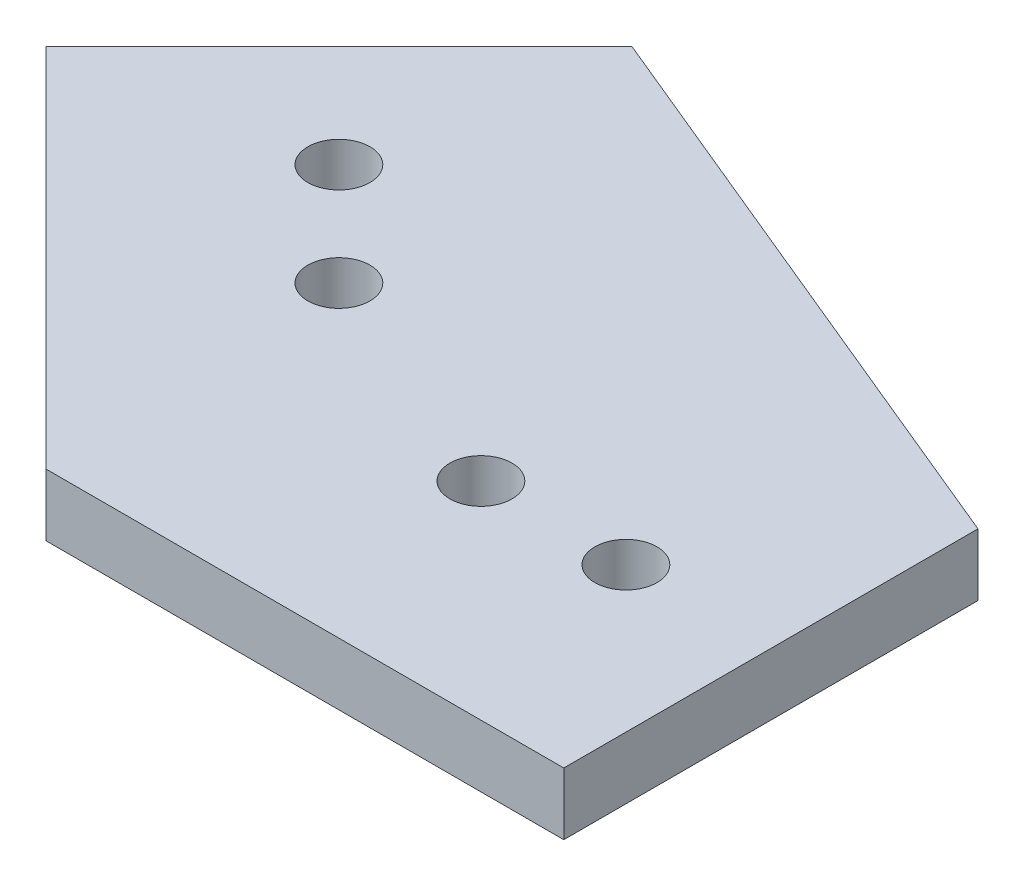
ISO-10303-21;
HEADER;
FILE_DESCRIPTION(('STEP AP214'),'2;1');
FILE_NAME('part.step','',(''),(''),'','','');
FILE_SCHEMA(('AUTOMOTIVE_DESIGN { 1 0 10303 214 1 1 1 1 }'));
ENDSEC;
DATA;
#1=APPLICATION_CONTEXT('core data for automotive mechanical design processes');
#2=APPLICATION_PROTOCOL_DEFINITION('international standard','automotive_design',2000,#1);
#3=PRODUCT_CONTEXT('',#1,'mechanical');
#4=PRODUCT('Part','Part','',(#3));
#5=PRODUCT_RELATED_PRODUCT_CATEGORY('part','',(#4));
#6=PRODUCT_DEFINITION_FORMATION('','',#4);
#7=PRODUCT_DEFINITION_CONTEXT('part definition',#1,'design');
#8=PRODUCT_DEFINITION('design','',#6,#7);
#9=PRODUCT_DEFINITION_SHAPE('','',#8);
#10=(LENGTH_UNIT() NAMED_UNIT(*) SI_UNIT(.MILLI.,.METRE.));
#11=(NAMED_UNIT(*) PLANE_ANGLE_UNIT() SI_UNIT($,.RADIAN.));
#12=(NAMED_UNIT(*) SI_UNIT($,.STERADIAN.) SOLID_ANGLE_UNIT());
#13=UNCERTAINTY_MEASURE_WITH_UNIT(LENGTH_MEASURE(1.E-05),#10,'distance_accuracy_value','');
#14=(GEOMETRIC_REPRESENTATION_CONTEXT(3) GLOBAL_UNCERTAINTY_ASSIGNED_CONTEXT((#13)) GLOBAL_UNIT_ASSIGNED_CONTEXT((#10,
#11,#12)) REPRESENTATION_CONTEXT('',''));
#15=CARTESIAN_POINT('',(0.,0.,0.));
#16=DIRECTION('',(0.,0.,1.));
#17=DIRECTION('',(1.,0.,0.));
#18=AXIS2_PLACEMENT_3D('',#15,#16,#17);
#19=CARTESIAN_POINT('',(0.,3.,0.));
#20=DIRECTION('',(0.,-1.,0.));
#21=DIRECTION('',(0.,0.,-1.));
#22=AXIS2_PLACEMENT_3D('',#19,#20,#21);
#23=PLANE('',#22);
#24=DIRECTION('',(0.707106781186551,0.,0.707106781186544));
#25=VECTOR('',#24,1.);
#26=CARTESIAN_POINT('',(0.,3.,0.));
#27=LINE('',#26,#25);
#28=CARTESIAN_POINT('',(-17.6776695296638,3.,-17.6776695296636));
#29=VERTEX_POINT('',#28);
#30=CARTESIAN_POINT('',(0.,3.,0.));
#31=VERTEX_POINT('',#30);
#32=EDGE_CURVE('E133',#29,#31,#27,.T.);
#33=ORIENTED_EDGE('',*,*,#32,.T.);
#34=DIRECTION('',(1.,0.,0.));
#35=VECTOR('',#34,1.);
#36=CARTESIAN_POINT('',(0.,3.,0.));
#37=LINE('',#36,#35);
#38=CARTESIAN_POINT('',(25.,3.,0.));
#39=VERTEX_POINT('',#38);
#40=EDGE_CURVE('E91',#31,#39,#37,.T.);
#41=ORIENTED_EDGE('',*,*,#40,.T.);
#42=DIRECTION('',(0.,0.,-1.));
#43=VECTOR('',#42,1.);
#44=CARTESIAN_POINT('',(25.,3.,0.));
#45=LINE('',#44,#43);
#46=CARTESIAN_POINT('',(25.,3.,-20.));
#47=VERTEX_POINT('',#46);
#48=EDGE_CURVE('E95',#39,#47,#45,.T.);
#49=ORIENTED_EDGE('',*,*,#48,.T.);
#50=DIRECTION('',(-0.923879532511288,0.,-0.382683432365087));
#51=VECTOR('',#50,1.);
#52=CARTESIAN_POINT('',(25.,3.,-20.));
#53=LINE('',#52,#51);
#54=CARTESIAN_POINT('',(-3.53553390593292,3.,-31.8198051533946));
#55=VERTEX_POINT('',#54);
#56=EDGE_CURVE('E99',#47,#55,#53,.T.);
#57=ORIENTED_EDGE('',*,*,#56,.T.);
#58=DIRECTION('',(-0.707106781186543,0.,0.707106781186552));
#59=VECTOR('',#58,1.);
#60=CARTESIAN_POINT('',(-17.6776695296638,3.,-17.6776695296636));
#61=LINE('',#60,#59);
#62=EDGE_CURVE('E57',#55,#29,#61,.T.);
#63=ORIENTED_EDGE('',*,*,#62,.T.);
#64=EDGE_LOOP('',(#33,#41,#49,#57,#63));
#65=FACE_BOUND('',#64,.T.);
#66=CARTESIAN_POINT('',(18.,3.,-10.));
#67=DIRECTION('',(0.,1.,0.));
#68=DIRECTION('',(0.,0.,1.));
#69=AXIS2_PLACEMENT_3D('',#66,#67,#68);
#70=CIRCLE('',#69,1.5);
#71=CARTESIAN_POINT('',(18.,3.,-8.5));
#72=VERTEX_POINT('',#71);
#73=EDGE_CURVE('E124',#72,#72,#70,.T.);
#74=ORIENTED_EDGE('',*,*,#73,.F.);
#75=EDGE_LOOP('',(#74));
#76=FACE_BOUND('',#75,.T.);
#77=CARTESIAN_POINT('',(11.,3.,-10.));
#78=DIRECTION('',(0.,1.,0.));
#79=DIRECTION('',(0.,0.,1.));
#80=AXIS2_PLACEMENT_3D('',#77,#78,#79);
#81=CIRCLE('',#80,1.5);
#82=CARTESIAN_POINT('',(11.,3.,-8.5));
#83=VERTEX_POINT('',#82);
#84=EDGE_CURVE('E199',#83,#83,#81,.T.);
#85=ORIENTED_EDGE('',*,*,#84,.F.);
#86=EDGE_LOOP('',(#85));
#87=FACE_BOUND('',#86,.T.);
#88=CARTESIAN_POINT('',(-5.65685424949249,3.,-19.7989898732233));
#89=DIRECTION('',(0.,1.,0.));
#90=DIRECTION('',(0.,0.,-1.));
#91=AXIS2_PLACEMENT_3D('',#88,#89,#90);
#92=CIRCLE('',#91,1.50000000000001);
#93=CARTESIAN_POINT('',(-5.65685424949249,3.,-21.2989898732233));
#94=VERTEX_POINT('',#93);
#95=EDGE_CURVE('E191',#94,#94,#92,.T.);
#96=ORIENTED_EDGE('',*,*,#95,.F.);
#97=EDGE_LOOP('',(#96));
#98=FACE_BOUND('',#97,.T.);
#99=CARTESIAN_POINT('',(-0.70710678118663,3.,-14.8492424049175));
#100=DIRECTION('',(0.,1.,0.));
#101=DIRECTION('',(0.,0.,-1.));
#102=AXIS2_PLACEMENT_3D('',#99,#100,#101);
#103=CIRCLE('',#102,1.5);
#104=CARTESIAN_POINT('',(-0.70710678118663,3.,-16.3492424049175));
#105=VERTEX_POINT('',#104);
#106=EDGE_CURVE('E180',#105,#105,#103,.T.);
#107=ORIENTED_EDGE('',*,*,#106,.F.);
#108=EDGE_LOOP('',(#107));
#109=FACE_BOUND('',#108,.T.);
#110=ADVANCED_FACE('F39',(#65,#76,#87,#98,#109),#23,.F.);
#111=CARTESIAN_POINT('',(0.,0.,0.));
#112=DIRECTION('',(0.,-1.,0.));
#113=DIRECTION('',(0.,0.,-1.));
#114=AXIS2_PLACEMENT_3D('',#111,#112,#113);
#115=PLANE('',#114);
#116=CARTESIAN_POINT('',(-5.65685424949249,0.,-19.7989898732233));
#117=DIRECTION('',(0.,1.,0.));
#118=DIRECTION('',(0.,0.,-1.));
#119=AXIS2_PLACEMENT_3D('',#116,#117,#118);
#120=CIRCLE('',#119,1.50000000000001);
#121=CARTESIAN_POINT('',(-5.65685424949249,0.,-21.2989898732233));
#122=VERTEX_POINT('',#121);
#123=EDGE_CURVE('E188',#122,#122,#120,.T.);
#124=ORIENTED_EDGE('',*,*,#123,.T.);
#125=EDGE_LOOP('',(#124));
#126=FACE_BOUND('',#125,.T.);
#127=CARTESIAN_POINT('',(18.,0.,-10.));
#128=DIRECTION('',(0.,1.,0.));
#129=DIRECTION('',(0.,0.,1.));
#130=AXIS2_PLACEMENT_3D('',#127,#128,#129);
#131=CIRCLE('',#130,1.5);
#132=CARTESIAN_POINT('',(18.,0.,-8.5));
#133=VERTEX_POINT('',#132);
#134=EDGE_CURVE('E203',#133,#133,#131,.T.);
#135=ORIENTED_EDGE('',*,*,#134,.T.);
#136=EDGE_LOOP('',(#135));
#137=FACE_BOUND('',#136,.T.);
#138=DIRECTION('',(0.707106781186551,0.,0.707106781186544));
#139=VECTOR('',#138,1.);
#140=CARTESIAN_POINT('',(0.,0.,0.));
#141=LINE('',#140,#139);
#142=CARTESIAN_POINT('',(-17.6776695296638,0.,-17.6776695296636));
#143=VERTEX_POINT('',#142);
#144=CARTESIAN_POINT('',(0.,0.,0.));
#145=VERTEX_POINT('',#144);
#146=EDGE_CURVE('E119',#143,#145,#141,.T.);
#147=ORIENTED_EDGE('',*,*,#146,.F.);
#148=DIRECTION('',(-0.707106781186543,0.,0.707106781186552));
#149=VECTOR('',#148,1.);
#150=CARTESIAN_POINT('',(-17.6776695296638,0.,-17.6776695296636));
#151=LINE('',#150,#149);
#152=CARTESIAN_POINT('',(-3.53553390593292,0.,-31.8198051533946));
#153=VERTEX_POINT('',#152);
#154=EDGE_CURVE('E83',#153,#143,#151,.T.);
#155=ORIENTED_EDGE('',*,*,#154,.F.);
#156=DIRECTION('',(-0.923879532511288,0.,-0.382683432365087));
#157=VECTOR('',#156,1.);
#158=CARTESIAN_POINT('',(25.,0.,-20.));
#159=LINE('',#158,#157);
#160=CARTESIAN_POINT('',(25.,0.,-20.));
#161=VERTEX_POINT('',#160);
#162=EDGE_CURVE('E77',#161,#153,#159,.T.);
#163=ORIENTED_EDGE('',*,*,#162,.F.);
#164=DIRECTION('',(0.,0.,-1.));
#165=VECTOR('',#164,1.);
#166=CARTESIAN_POINT('',(25.,0.,0.));
#167=LINE('',#166,#165);
#168=CARTESIAN_POINT('',(25.,0.,0.));
#169=VERTEX_POINT('',#168);
#170=EDGE_CURVE('E107',#169,#161,#167,.T.);
#171=ORIENTED_EDGE('',*,*,#170,.F.);
#172=DIRECTION('',(1.,0.,0.));
#173=VECTOR('',#172,1.);
#174=CARTESIAN_POINT('',(0.,0.,0.));
#175=LINE('',#174,#173);
#176=EDGE_CURVE('E123',#145,#169,#175,.T.);
#177=ORIENTED_EDGE('',*,*,#176,.F.);
#178=EDGE_LOOP('',(#147,#155,#163,#171,#177));
#179=FACE_BOUND('',#178,.T.);
#180=CARTESIAN_POINT('',(11.,0.,-10.));
#181=DIRECTION('',(0.,1.,0.));
#182=DIRECTION('',(0.,0.,1.));
#183=AXIS2_PLACEMENT_3D('',#180,#181,#182);
#184=CIRCLE('',#183,1.5);
#185=CARTESIAN_POINT('',(11.,0.,-8.5));
#186=VERTEX_POINT('',#185);
#187=EDGE_CURVE('E195',#186,#186,#184,.T.);
#188=ORIENTED_EDGE('',*,*,#187,.T.);
#189=EDGE_LOOP('',(#188));
#190=FACE_BOUND('',#189,.T.);
#191=CARTESIAN_POINT('',(-0.70710678118663,0.,-14.8492424049175));
#192=DIRECTION('',(0.,1.,0.));
#193=DIRECTION('',(0.,0.,-1.));
#194=AXIS2_PLACEMENT_3D('',#191,#192,#193);
#195=CIRCLE('',#194,1.5);
#196=CARTESIAN_POINT('',(-0.70710678118663,0.,-16.3492424049175));
#197=VERTEX_POINT('',#196);
#198=EDGE_CURVE('E183',#197,#197,#195,.T.);
#199=ORIENTED_EDGE('',*,*,#198,.T.);
#200=EDGE_LOOP('',(#199));
#201=FACE_BOUND('',#200,.T.);
#202=ADVANCED_FACE('F140',(#126,#137,#179,#190,#201),#115,.T.);
#203=CARTESIAN_POINT('',(0.,3.,0.));
#204=DIRECTION('',(0.707106781186544,0.,-0.707106781186551));
#205=DIRECTION('',(-0.707106781186551,0.,-0.707106781186544));
#206=AXIS2_PLACEMENT_3D('',#203,#204,#205);
#207=PLANE('',#206);
#208=ORIENTED_EDGE('',*,*,#146,.T.);
#209=DIRECTION('',(0.,-1.,0.));
#210=VECTOR('',#209,1.);
#211=CARTESIAN_POINT('',(0.,3.,0.));
#212=LINE('',#211,#210);
#213=EDGE_CURVE('E11',#31,#145,#212,.T.);
#214=ORIENTED_EDGE('',*,*,#213,.F.);
#215=ORIENTED_EDGE('',*,*,#32,.F.);
#216=DIRECTION('',(0.,-1.,0.));
#217=VECTOR('',#216,1.);
#218=CARTESIAN_POINT('',(-17.6776695296638,3.,-17.6776695296636));
#219=LINE('',#218,#217);
#220=EDGE_CURVE('E115',#29,#143,#219,.T.);
#221=ORIENTED_EDGE('',*,*,#220,.T.);
#222=EDGE_LOOP('',(#208,#214,#215,#221));
#223=FACE_BOUND('',#222,.T.);
#224=ADVANCED_FACE('F41',(#223),#207,.F.);
#225=CARTESIAN_POINT('',(0.,3.,0.));
#226=DIRECTION('',(0.,0.,-1.));
#227=DIRECTION('',(-1.,0.,0.));
#228=AXIS2_PLACEMENT_3D('',#225,#226,#227);
#229=PLANE('',#228);
#230=ORIENTED_EDGE('',*,*,#176,.T.);
#231=DIRECTION('',(0.,-1.,0.));
#232=VECTOR('',#231,1.);
#233=CARTESIAN_POINT('',(25.,3.,0.));
#234=LINE('',#233,#232);
#235=EDGE_CURVE('E49',#39,#169,#234,.T.);
#236=ORIENTED_EDGE('',*,*,#235,.F.);
#237=ORIENTED_EDGE('',*,*,#40,.F.);
#238=ORIENTED_EDGE('',*,*,#213,.T.);
#239=EDGE_LOOP('',(#230,#236,#237,#238));
#240=FACE_BOUND('',#239,.T.);
#241=ADVANCED_FACE('F259',(#240),#229,.F.);
#242=CARTESIAN_POINT('',(25.,3.,0.));
#243=DIRECTION('',(-1.,0.,0.));
#244=DIRECTION('',(0.,0.,1.));
#245=AXIS2_PLACEMENT_3D('',#242,#243,#244);
#246=PLANE('',#245);
#247=ORIENTED_EDGE('',*,*,#170,.T.);
#248=DIRECTION('',(0.,-1.,0.));
#249=VECTOR('',#248,1.);
#250=CARTESIAN_POINT('',(25.,3.,-20.));
#251=LINE('',#250,#249);
#252=EDGE_CURVE('E104',#47,#161,#251,.T.);
#253=ORIENTED_EDGE('',*,*,#252,.F.);
#254=ORIENTED_EDGE('',*,*,#48,.F.);
#255=ORIENTED_EDGE('',*,*,#235,.T.);
#256=EDGE_LOOP('',(#247,#253,#254,#255));
#257=FACE_BOUND('',#256,.T.);
#258=ADVANCED_FACE('F105',(#257),#246,.F.);
#259=CARTESIAN_POINT('',(25.,3.,-20.));
#260=DIRECTION('',(-0.382683432365087,0.,0.923879532511288));
#261=DIRECTION('',(0.923879532511288,0.,0.382683432365087));
#262=AXIS2_PLACEMENT_3D('',#259,#260,#261);
#263=PLANE('',#262);
#264=ORIENTED_EDGE('',*,*,#162,.T.);
#265=DIRECTION('',(0.,-1.,0.));
#266=VECTOR('',#265,1.);
#267=CARTESIAN_POINT('',(-3.53553390593292,3.,-31.8198051533946));
#268=LINE('',#267,#266);
#269=EDGE_CURVE('E109',#55,#153,#268,.T.);
#270=ORIENTED_EDGE('',*,*,#269,.F.);
#271=ORIENTED_EDGE('',*,*,#56,.F.);
#272=ORIENTED_EDGE('',*,*,#252,.T.);
#273=EDGE_LOOP('',(#264,#270,#271,#272));
#274=FACE_BOUND('',#273,.T.);
#275=ADVANCED_FACE('F111',(#274),#263,.F.);
#276=CARTESIAN_POINT('',(-17.6776695296638,3.,-17.6776695296636));
#277=DIRECTION('',(0.707106781186552,0.,0.707106781186543));
#278=DIRECTION('',(0.707106781186543,0.,-0.707106781186552));
#279=AXIS2_PLACEMENT_3D('',#276,#277,#278);
#280=PLANE('',#279);
#281=ORIENTED_EDGE('',*,*,#154,.T.);
#282=ORIENTED_EDGE('',*,*,#220,.F.);
#283=ORIENTED_EDGE('',*,*,#62,.F.);
#284=ORIENTED_EDGE('',*,*,#269,.T.);
#285=EDGE_LOOP('',(#281,#282,#283,#284));
#286=FACE_BOUND('',#285,.T.);
#287=ADVANCED_FACE('F145',(#286),#280,.F.);
#288=CARTESIAN_POINT('',(18.,3.,-10.));
#289=DIRECTION('',(0.,-1.,0.));
#290=DIRECTION('',(0.,0.,-1.));
#291=AXIS2_PLACEMENT_3D('',#288,#289,#290);
#292=CYLINDRICAL_SURFACE('',#291,1.5);
#293=ORIENTED_EDGE('',*,*,#73,.T.);
#294=EDGE_LOOP('',(#293));
#295=FACE_BOUND('',#294,.T.);
#296=ORIENTED_EDGE('',*,*,#134,.F.);
#297=EDGE_LOOP('',(#296));
#298=FACE_BOUND('',#297,.T.);
#299=ADVANCED_FACE('F147',(#295,#298),#292,.F.);
#300=CARTESIAN_POINT('',(11.,3.,-10.));
#301=DIRECTION('',(0.,-1.,0.));
#302=DIRECTION('',(0.,0.,-1.));
#303=AXIS2_PLACEMENT_3D('',#300,#301,#302);
#304=CYLINDRICAL_SURFACE('',#303,1.5);
#305=ORIENTED_EDGE('',*,*,#84,.T.);
#306=EDGE_LOOP('',(#305));
#307=FACE_BOUND('',#306,.T.);
#308=ORIENTED_EDGE('',*,*,#187,.F.);
#309=EDGE_LOOP('',(#308));
#310=FACE_BOUND('',#309,.T.);
#311=ADVANCED_FACE('F153',(#307,#310),#304,.F.);
#312=CARTESIAN_POINT('',(-5.65685424949249,3.,-19.7989898732233));
#313=DIRECTION('',(0.,-1.,0.));
#314=DIRECTION('',(0.,0.,-1.));
#315=AXIS2_PLACEMENT_3D('',#312,#313,#314);
#316=CYLINDRICAL_SURFACE('',#315,1.50000000000001);
#317=ORIENTED_EDGE('',*,*,#95,.T.);
#318=EDGE_LOOP('',(#317));
#319=FACE_BOUND('',#318,.T.);
#320=ORIENTED_EDGE('',*,*,#123,.F.);
#321=EDGE_LOOP('',(#320));
#322=FACE_BOUND('',#321,.T.);
#323=ADVANCED_FACE('F167',(#319,#322),#316,.F.);
#324=CARTESIAN_POINT('',(-0.70710678118663,3.,-14.8492424049175));
#325=DIRECTION('',(0.,-1.,0.));
#326=DIRECTION('',(0.,0.,-1.));
#327=AXIS2_PLACEMENT_3D('',#324,#325,#326);
#328=CYLINDRICAL_SURFACE('',#327,1.5);
#329=ORIENTED_EDGE('',*,*,#106,.T.);
#330=EDGE_LOOP('',(#329));
#331=FACE_BOUND('',#330,.T.);
#332=ORIENTED_EDGE('',*,*,#198,.F.);
#333=EDGE_LOOP('',(#332));
#334=FACE_BOUND('',#333,.T.);
#335=ADVANCED_FACE('F171',(#331,#334),#328,.F.);
#336=CLOSED_SHELL('',(#110,#202,#224,#241,#258,#275,#287,#299,#311,#323,#335));
#337=MANIFOLD_SOLID_BREP('B2',#336);
#338=ADVANCED_BREP_SHAPE_REPRESENTATION('',(#18,#337),#14);
#339=SHAPE_DEFINITION_REPRESENTATION(#9,#338);
ENDSEC;
END-ISO-10303-21;
